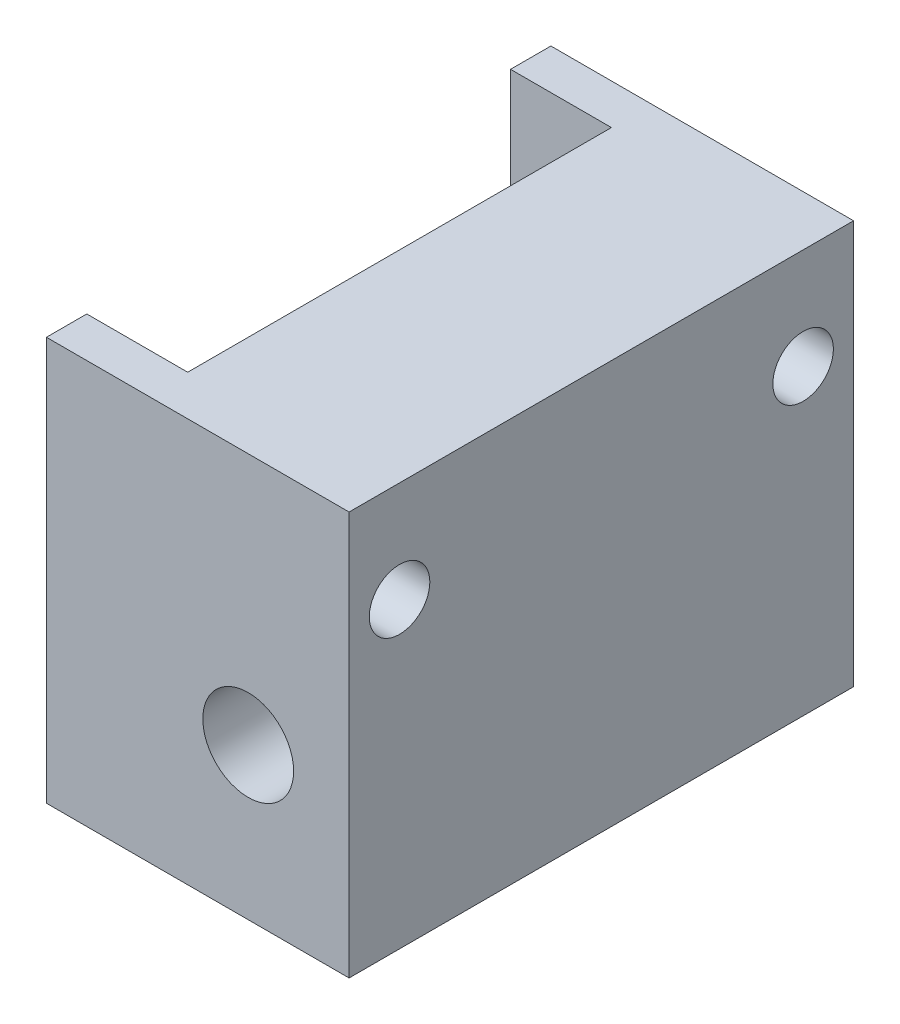
ISO-10303-21;
HEADER;
FILE_DESCRIPTION(('STEP AP214'),'2;1');
FILE_NAME('part.step','',(''),(''),'','','');
FILE_SCHEMA(('AUTOMOTIVE_DESIGN { 1 0 10303 214 1 1 1 1 }'));
ENDSEC;
DATA;
#1=APPLICATION_CONTEXT('core data for automotive mechanical design processes');
#2=APPLICATION_PROTOCOL_DEFINITION('international standard','automotive_design',2000,#1);
#3=PRODUCT_CONTEXT('',#1,'mechanical');
#4=PRODUCT('Part','Part','',(#3));
#5=PRODUCT_RELATED_PRODUCT_CATEGORY('part','',(#4));
#6=PRODUCT_DEFINITION_FORMATION('','',#4);
#7=PRODUCT_DEFINITION_CONTEXT('part definition',#1,'design');
#8=PRODUCT_DEFINITION('design','',#6,#7);
#9=PRODUCT_DEFINITION_SHAPE('','',#8);
#10=(LENGTH_UNIT() NAMED_UNIT(*) SI_UNIT(.MILLI.,.METRE.));
#11=(NAMED_UNIT(*) PLANE_ANGLE_UNIT() SI_UNIT($,.RADIAN.));
#12=(NAMED_UNIT(*) SI_UNIT($,.STERADIAN.) SOLID_ANGLE_UNIT());
#13=UNCERTAINTY_MEASURE_WITH_UNIT(LENGTH_MEASURE(1.E-05),#10,'distance_accuracy_value','');
#14=(GEOMETRIC_REPRESENTATION_CONTEXT(3) GLOBAL_UNCERTAINTY_ASSIGNED_CONTEXT((#13)) GLOBAL_UNIT_ASSIGNED_CONTEXT((#10,
#11,#12)) REPRESENTATION_CONTEXT('',''));
#15=CARTESIAN_POINT('',(0.,0.,0.));
#16=DIRECTION('',(0.,0.,1.));
#17=DIRECTION('',(1.,0.,0.));
#18=AXIS2_PLACEMENT_3D('',#15,#16,#17);
#19=CARTESIAN_POINT('',(-13.8064516129032,40.,-10.2096774193548));
#20=DIRECTION('',(1.,0.,0.));
#21=DIRECTION('',(0.,0.,-1.));
#22=AXIS2_PLACEMENT_3D('',#19,#20,#21);
#23=PLANE('',#22);
#24=DIRECTION('',(0.,-1.,0.));
#25=VECTOR('',#24,1.);
#26=CARTESIAN_POINT('',(-13.8064516129032,0.,35.7903225806452));
#27=LINE('',#26,#25);
#28=CARTESIAN_POINT('',(-13.8064516129032,40.,35.7903225806452));
#29=VERTEX_POINT('',#28);
#30=CARTESIAN_POINT('',(-13.8064516129032,32.8284271247462,35.7903225806452));
#31=VERTEX_POINT('',#30);
#32=EDGE_CURVE('E49',#29,#31,#27,.T.);
#33=ORIENTED_EDGE('',*,*,#32,.F.);
#34=DIRECTION('',(0.,0.,1.));
#35=VECTOR('',#34,1.);
#36=CARTESIAN_POINT('',(-13.8064516129032,40.,-10.2096774193548));
#37=LINE('',#36,#35);
#38=CARTESIAN_POINT('',(-13.8064516129032,40.,-6.20967741935483));
#39=VERTEX_POINT('',#38);
#40=EDGE_CURVE('E133',#39,#29,#37,.T.);
#41=ORIENTED_EDGE('',*,*,#40,.F.);
#42=DIRECTION('',(0.,1.,0.));
#43=VECTOR('',#42,1.);
#44=CARTESIAN_POINT('',(-13.8064516129032,0.,-6.20967741935483));
#45=LINE('',#44,#43);
#46=CARTESIAN_POINT('',(-13.8064516129032,32.8284271247462,-6.20967741935483));
#47=VERTEX_POINT('',#46);
#48=EDGE_CURVE('E11',#47,#39,#45,.T.);
#49=ORIENTED_EDGE('',*,*,#48,.F.);
#50=CARTESIAN_POINT('',(-13.8064516129032,30.,-5.20967741935483));
#51=DIRECTION('',(1.,0.,0.));
#52=DIRECTION('',(0.,0.,-1.));
#53=AXIS2_PLACEMENT_3D('',#50,#51,#52);
#54=CIRCLE('',#53,3.);
#55=CARTESIAN_POINT('',(-13.8064516129032,27.1715728752538,-6.20967741935483));
#56=VERTEX_POINT('',#55);
#57=EDGE_CURVE('E176',#47,#56,#54,.T.);
#58=ORIENTED_EDGE('',*,*,#57,.T.);
#59=CARTESIAN_POINT('',(-13.8064516129032,0.,-6.20967741935483));
#60=VERTEX_POINT('',#59);
#61=EDGE_CURVE('E137',#60,#56,#45,.T.);
#62=ORIENTED_EDGE('',*,*,#61,.F.);
#63=DIRECTION('',(0.,0.,1.));
#64=VECTOR('',#63,1.);
#65=CARTESIAN_POINT('',(-13.8064516129032,0.,-10.2096774193548));
#66=LINE('',#65,#64);
#67=CARTESIAN_POINT('',(-13.8064516129032,0.,35.7903225806452));
#68=VERTEX_POINT('',#67);
#69=EDGE_CURVE('E56',#60,#68,#66,.T.);
#70=ORIENTED_EDGE('',*,*,#69,.T.);
#71=CARTESIAN_POINT('',(-13.8064516129032,27.1715728752538,35.7903225806452));
#72=VERTEX_POINT('',#71);
#73=EDGE_CURVE('E236',#72,#68,#27,.T.);
#74=ORIENTED_EDGE('',*,*,#73,.F.);
#75=CARTESIAN_POINT('',(-13.8064516129032,30.,34.7903225806452));
#76=DIRECTION('',(1.,0.,0.));
#77=DIRECTION('',(0.,0.,-1.));
#78=AXIS2_PLACEMENT_3D('',#75,#76,#77);
#79=CIRCLE('',#78,3.);
#80=EDGE_CURVE('E186',#72,#31,#79,.T.);
#81=ORIENTED_EDGE('',*,*,#80,.T.);
#82=EDGE_LOOP('',(#33,#41,#49,#58,#62,#70,#74,#81));
#83=FACE_BOUND('',#82,.T.);
#84=ADVANCED_FACE('F33',(#83),#23,.F.);
#85=CARTESIAN_POINT('',(-13.8064516129032,40.,39.7903225806452));
#86=DIRECTION('',(0.,0.,-1.));
#87=DIRECTION('',(-1.,0.,0.));
#88=AXIS2_PLACEMENT_3D('',#85,#86,#87);
#89=PLANE('',#88);
#90=CARTESIAN_POINT('',(-3.80645161290322,15.,39.7903225806452));
#91=DIRECTION('',(0.,0.,1.));
#92=DIRECTION('',(1.,0.,0.));
#93=AXIS2_PLACEMENT_3D('',#90,#91,#92);
#94=CIRCLE('',#93,4.5);
#95=CARTESIAN_POINT('',(0.693548387096778,15.,39.7903225806452));
#96=VERTEX_POINT('',#95);
#97=EDGE_CURVE('E190',#96,#96,#94,.T.);
#98=ORIENTED_EDGE('',*,*,#97,.F.);
#99=EDGE_LOOP('',(#98));
#100=FACE_BOUND('',#99,.T.);
#101=DIRECTION('',(1.,0.,0.));
#102=VECTOR('',#101,1.);
#103=CARTESIAN_POINT('',(-13.8064516129032,0.,39.7903225806452));
#104=LINE('',#103,#102);
#105=CARTESIAN_POINT('',(-23.8064516129032,0.,39.7903225806452));
#106=VERTEX_POINT('',#105);
#107=CARTESIAN_POINT('',(6.19354838709678,0.,39.7903225806452));
#108=VERTEX_POINT('',#107);
#109=EDGE_CURVE('E202',#106,#108,#104,.T.);
#110=ORIENTED_EDGE('',*,*,#109,.T.);
#111=DIRECTION('',(0.,-1.,0.));
#112=VECTOR('',#111,1.);
#113=CARTESIAN_POINT('',(6.19354838709678,40.,39.7903225806452));
#114=LINE('',#113,#112);
#115=CARTESIAN_POINT('',(6.19354838709678,40.,39.7903225806452));
#116=VERTEX_POINT('',#115);
#117=EDGE_CURVE('E41',#116,#108,#114,.T.);
#118=ORIENTED_EDGE('',*,*,#117,.F.);
#119=DIRECTION('',(1.,0.,0.));
#120=VECTOR('',#119,1.);
#121=CARTESIAN_POINT('',(-13.8064516129032,40.,39.7903225806452));
#122=LINE('',#121,#120);
#123=CARTESIAN_POINT('',(-23.8064516129032,40.,39.7903225806452));
#124=VERTEX_POINT('',#123);
#125=EDGE_CURVE('E196',#124,#116,#122,.T.);
#126=ORIENTED_EDGE('',*,*,#125,.F.);
#127=DIRECTION('',(0.,1.,0.));
#128=VECTOR('',#127,1.);
#129=CARTESIAN_POINT('',(-23.8064516129032,40.,39.7903225806452));
#130=LINE('',#129,#128);
#131=EDGE_CURVE('E128',#106,#124,#130,.T.);
#132=ORIENTED_EDGE('',*,*,#131,.F.);
#133=EDGE_LOOP('',(#110,#118,#126,#132));
#134=FACE_BOUND('',#133,.T.);
#135=ADVANCED_FACE('F257',(#100,#134),#89,.F.);
#136=CARTESIAN_POINT('',(6.19354838709677,40.,-10.2096774193548));
#137=DIRECTION('',(-1.,0.,0.));
#138=DIRECTION('',(0.,0.,1.));
#139=AXIS2_PLACEMENT_3D('',#136,#137,#138);
#140=PLANE('',#139);
#141=CARTESIAN_POINT('',(6.19354838709677,30.,-5.20967741935483));
#142=DIRECTION('',(1.,0.,0.));
#143=DIRECTION('',(0.,0.,-1.));
#144=AXIS2_PLACEMENT_3D('',#141,#142,#143);
#145=CIRCLE('',#144,3.);
#146=CARTESIAN_POINT('',(6.19354838709677,30.,-8.20967741935483));
#147=VERTEX_POINT('',#146);
#148=EDGE_CURVE('E155',#147,#147,#145,.T.);
#149=ORIENTED_EDGE('',*,*,#148,.F.);
#150=EDGE_LOOP('',(#149));
#151=FACE_BOUND('',#150,.T.);
#152=CARTESIAN_POINT('',(6.19354838709678,30.,34.7903225806452));
#153=DIRECTION('',(1.,0.,0.));
#154=DIRECTION('',(0.,0.,-1.));
#155=AXIS2_PLACEMENT_3D('',#152,#153,#154);
#156=CIRCLE('',#155,3.);
#157=CARTESIAN_POINT('',(6.19354838709678,30.,31.7903225806452));
#158=VERTEX_POINT('',#157);
#159=EDGE_CURVE('E180',#158,#158,#156,.T.);
#160=ORIENTED_EDGE('',*,*,#159,.F.);
#161=EDGE_LOOP('',(#160));
#162=FACE_BOUND('',#161,.T.);
#163=DIRECTION('',(0.,0.,-1.));
#164=VECTOR('',#163,1.);
#165=CARTESIAN_POINT('',(6.19354838709677,0.,-10.2096774193548));
#166=LINE('',#165,#164);
#167=CARTESIAN_POINT('',(6.19354838709677,0.,-10.2096774193548));
#168=VERTEX_POINT('',#167);
#169=EDGE_CURVE('E209',#108,#168,#166,.T.);
#170=ORIENTED_EDGE('',*,*,#169,.T.);
#171=DIRECTION('',(0.,-1.,0.));
#172=VECTOR('',#171,1.);
#173=CARTESIAN_POINT('',(6.19354838709677,40.,-10.2096774193548));
#174=LINE('',#173,#172);
#175=CARTESIAN_POINT('',(6.19354838709677,40.,-10.2096774193548));
#176=VERTEX_POINT('',#175);
#177=EDGE_CURVE('E212',#176,#168,#174,.T.);
#178=ORIENTED_EDGE('',*,*,#177,.F.);
#179=DIRECTION('',(0.,0.,-1.));
#180=VECTOR('',#179,1.);
#181=CARTESIAN_POINT('',(6.19354838709677,40.,-10.2096774193548));
#182=LINE('',#181,#180);
#183=EDGE_CURVE('E221',#116,#176,#182,.T.);
#184=ORIENTED_EDGE('',*,*,#183,.F.);
#185=ORIENTED_EDGE('',*,*,#117,.T.);
#186=EDGE_LOOP('',(#170,#178,#184,#185));
#187=FACE_BOUND('',#186,.T.);
#188=ADVANCED_FACE('F219',(#151,#162,#187),#140,.F.);
#189=CARTESIAN_POINT('',(-13.8064516129032,40.,-10.2096774193548));
#190=DIRECTION('',(0.,0.,1.));
#191=DIRECTION('',(1.,0.,0.));
#192=AXIS2_PLACEMENT_3D('',#189,#190,#191);
#193=PLANE('',#192);
#194=CARTESIAN_POINT('',(-3.80645161290322,15.,-10.2096774193548));
#195=DIRECTION('',(0.,0.,1.));
#196=DIRECTION('',(1.,0.,0.));
#197=AXIS2_PLACEMENT_3D('',#194,#195,#196);
#198=CIRCLE('',#197,4.5);
#199=CARTESIAN_POINT('',(0.693548387096778,15.,-10.2096774193548));
#200=VERTEX_POINT('',#199);
#201=EDGE_CURVE('E193',#200,#200,#198,.T.);
#202=ORIENTED_EDGE('',*,*,#201,.T.);
#203=EDGE_LOOP('',(#202));
#204=FACE_BOUND('',#203,.T.);
#205=DIRECTION('',(-1.,0.,0.));
#206=VECTOR('',#205,1.);
#207=CARTESIAN_POINT('',(-13.8064516129032,0.,-10.2096774193548));
#208=LINE('',#207,#206);
#209=CARTESIAN_POINT('',(-23.8064516129032,0.,-10.2096774193548));
#210=VERTEX_POINT('',#209);
#211=EDGE_CURVE('E199',#168,#210,#208,.T.);
#212=ORIENTED_EDGE('',*,*,#211,.T.);
#213=DIRECTION('',(0.,-1.,0.));
#214=VECTOR('',#213,1.);
#215=CARTESIAN_POINT('',(-23.8064516129032,40.,-10.2096774193548));
#216=LINE('',#215,#214);
#217=CARTESIAN_POINT('',(-23.8064516129032,40.,-10.2096774193548));
#218=VERTEX_POINT('',#217);
#219=EDGE_CURVE('E150',#218,#210,#216,.T.);
#220=ORIENTED_EDGE('',*,*,#219,.F.);
#221=DIRECTION('',(-1.,0.,0.));
#222=VECTOR('',#221,1.);
#223=CARTESIAN_POINT('',(-13.8064516129032,40.,-10.2096774193548));
#224=LINE('',#223,#222);
#225=EDGE_CURVE('E207',#176,#218,#224,.T.);
#226=ORIENTED_EDGE('',*,*,#225,.F.);
#227=ORIENTED_EDGE('',*,*,#177,.T.);
#228=EDGE_LOOP('',(#212,#220,#226,#227));
#229=FACE_BOUND('',#228,.T.);
#230=ADVANCED_FACE('F229',(#204,#229),#193,.F.);
#231=CARTESIAN_POINT('',(0.,40.,0.));
#232=DIRECTION('',(0.,1.,0.));
#233=DIRECTION('',(0.,0.,1.));
#234=AXIS2_PLACEMENT_3D('',#231,#232,#233);
#235=PLANE('',#234);
#236=ORIENTED_EDGE('',*,*,#225,.T.);
#237=DIRECTION('',(0.,0.,-1.));
#238=VECTOR('',#237,1.);
#239=CARTESIAN_POINT('',(-23.8064516129032,40.,-6.20967741935483));
#240=LINE('',#239,#238);
#241=CARTESIAN_POINT('',(-23.8064516129032,40.,-6.20967741935483));
#242=VERTEX_POINT('',#241);
#243=EDGE_CURVE('E147',#242,#218,#240,.T.);
#244=ORIENTED_EDGE('',*,*,#243,.F.);
#245=DIRECTION('',(1.,0.,0.));
#246=VECTOR('',#245,1.);
#247=CARTESIAN_POINT('',(-23.8064516129032,40.,-6.20967741935483));
#248=LINE('',#247,#246);
#249=EDGE_CURVE('E152',#242,#39,#248,.T.);
#250=ORIENTED_EDGE('',*,*,#249,.T.);
#251=ORIENTED_EDGE('',*,*,#40,.T.);
#252=DIRECTION('',(1.,0.,0.));
#253=VECTOR('',#252,1.);
#254=CARTESIAN_POINT('',(-23.8064516129032,40.,35.7903225806452));
#255=LINE('',#254,#253);
#256=CARTESIAN_POINT('',(-23.8064516129032,40.,35.7903225806452));
#257=VERTEX_POINT('',#256);
#258=EDGE_CURVE('E115',#257,#29,#255,.T.);
#259=ORIENTED_EDGE('',*,*,#258,.F.);
#260=DIRECTION('',(0.,0.,-1.));
#261=VECTOR('',#260,1.);
#262=CARTESIAN_POINT('',(-23.8064516129032,40.,35.7903225806452));
#263=LINE('',#262,#261);
#264=EDGE_CURVE('E122',#124,#257,#263,.T.);
#265=ORIENTED_EDGE('',*,*,#264,.F.);
#266=ORIENTED_EDGE('',*,*,#125,.T.);
#267=ORIENTED_EDGE('',*,*,#183,.T.);
#268=EDGE_LOOP('',(#236,#244,#250,#251,#259,#265,#266,#267));
#269=FACE_BOUND('',#268,.T.);
#270=ADVANCED_FACE('F131',(#269),#235,.T.);
#271=CARTESIAN_POINT('',(0.,0.,0.));
#272=DIRECTION('',(0.,1.,0.));
#273=DIRECTION('',(0.,0.,1.));
#274=AXIS2_PLACEMENT_3D('',#271,#272,#273);
#275=PLANE('',#274);
#276=ORIENTED_EDGE('',*,*,#69,.F.);
#277=DIRECTION('',(1.,0.,0.));
#278=VECTOR('',#277,1.);
#279=CARTESIAN_POINT('',(-23.8064516129032,0.,-6.20967741935483));
#280=LINE('',#279,#278);
#281=CARTESIAN_POINT('',(-23.8064516129032,0.,-6.20967741935483));
#282=VERTEX_POINT('',#281);
#283=EDGE_CURVE('E164',#282,#60,#280,.T.);
#284=ORIENTED_EDGE('',*,*,#283,.F.);
#285=DIRECTION('',(0.,0.,1.));
#286=VECTOR('',#285,1.);
#287=CARTESIAN_POINT('',(-23.8064516129032,0.,-10.2096774193548));
#288=LINE('',#287,#286);
#289=EDGE_CURVE('E142',#210,#282,#288,.T.);
#290=ORIENTED_EDGE('',*,*,#289,.F.);
#291=ORIENTED_EDGE('',*,*,#211,.F.);
#292=ORIENTED_EDGE('',*,*,#169,.F.);
#293=ORIENTED_EDGE('',*,*,#109,.F.);
#294=DIRECTION('',(0.,0.,1.));
#295=VECTOR('',#294,1.);
#296=CARTESIAN_POINT('',(-23.8064516129032,0.,39.7903225806452));
#297=LINE('',#296,#295);
#298=CARTESIAN_POINT('',(-23.8064516129032,0.,35.7903225806452));
#299=VERTEX_POINT('',#298);
#300=EDGE_CURVE('E121',#299,#106,#297,.T.);
#301=ORIENTED_EDGE('',*,*,#300,.F.);
#302=DIRECTION('',(1.,0.,0.));
#303=VECTOR('',#302,1.);
#304=CARTESIAN_POINT('',(-23.8064516129032,0.,35.7903225806452));
#305=LINE('',#304,#303);
#306=EDGE_CURVE('E117',#299,#68,#305,.T.);
#307=ORIENTED_EDGE('',*,*,#306,.T.);
#308=EDGE_LOOP('',(#276,#284,#290,#291,#292,#293,#301,#307));
#309=FACE_BOUND('',#308,.T.);
#310=ADVANCED_FACE('F225',(#309),#275,.F.);
#311=CARTESIAN_POINT('',(-3.80645161290322,15.,-20.2096774193548));
#312=DIRECTION('',(0.,0.,1.));
#313=DIRECTION('',(1.,0.,0.));
#314=AXIS2_PLACEMENT_3D('',#311,#312,#313);
#315=CYLINDRICAL_SURFACE('',#314,4.5);
#316=ORIENTED_EDGE('',*,*,#97,.T.);
#317=EDGE_LOOP('',(#316));
#318=FACE_BOUND('',#317,.T.);
#319=ORIENTED_EDGE('',*,*,#201,.F.);
#320=EDGE_LOOP('',(#319));
#321=FACE_BOUND('',#320,.T.);
#322=ADVANCED_FACE('F245',(#318,#321),#315,.F.);
#323=CARTESIAN_POINT('',(-53.8064516129032,30.,34.7903225806452));
#324=DIRECTION('',(1.,0.,0.));
#325=DIRECTION('',(0.,0.,-1.));
#326=AXIS2_PLACEMENT_3D('',#323,#324,#325);
#327=CYLINDRICAL_SURFACE('',#326,3.);
#328=ORIENTED_EDGE('',*,*,#159,.T.);
#329=EDGE_LOOP('',(#328));
#330=FACE_BOUND('',#329,.T.);
#331=EDGE_CURVE('E187',#31,#72,#79,.T.);
#332=ORIENTED_EDGE('',*,*,#331,.F.);
#333=ORIENTED_EDGE('',*,*,#80,.F.);
#334=EDGE_LOOP('',(#332,#333));
#335=FACE_BOUND('',#334,.T.);
#336=ADVANCED_FACE('F243',(#330,#335),#327,.F.);
#337=CARTESIAN_POINT('',(-53.8064516129032,30.,-5.20967741935483));
#338=DIRECTION('',(1.,0.,0.));
#339=DIRECTION('',(0.,0.,-1.));
#340=AXIS2_PLACEMENT_3D('',#337,#338,#339);
#341=CYLINDRICAL_SURFACE('',#340,3.);
#342=ORIENTED_EDGE('',*,*,#148,.T.);
#343=EDGE_LOOP('',(#342));
#344=FACE_BOUND('',#343,.T.);
#345=ORIENTED_EDGE('',*,*,#57,.F.);
#346=EDGE_CURVE('E169',#56,#47,#54,.T.);
#347=ORIENTED_EDGE('',*,*,#346,.F.);
#348=EDGE_LOOP('',(#345,#347));
#349=FACE_BOUND('',#348,.T.);
#350=ADVANCED_FACE('F179',(#344,#349),#341,.F.);
#351=CARTESIAN_POINT('',(-13.8064516129032,0.,0.));
#352=DIRECTION('',(-1.,0.,0.));
#353=DIRECTION('',(0.,0.,1.));
#354=AXIS2_PLACEMENT_3D('',#351,#352,#353);
#355=PLANE('',#354);
#356=EDGE_CURVE('E134',#56,#47,#45,.T.);
#357=ORIENTED_EDGE('',*,*,#356,.F.);
#358=ORIENTED_EDGE('',*,*,#346,.T.);
#359=EDGE_LOOP('',(#357,#358));
#360=FACE_BOUND('',#359,.T.);
#361=ADVANCED_FACE('F182',(#360),#355,.F.);
#362=CARTESIAN_POINT('',(-23.8064516129032,0.,-6.20967741935483));
#363=DIRECTION('',(0.,0.,-1.));
#364=DIRECTION('',(-1.,0.,0.));
#365=AXIS2_PLACEMENT_3D('',#362,#363,#364);
#366=PLANE('',#365);
#367=ORIENTED_EDGE('',*,*,#61,.T.);
#368=ORIENTED_EDGE('',*,*,#356,.T.);
#369=ORIENTED_EDGE('',*,*,#48,.T.);
#370=ORIENTED_EDGE('',*,*,#249,.F.);
#371=DIRECTION('',(0.,1.,0.));
#372=VECTOR('',#371,1.);
#373=CARTESIAN_POINT('',(-23.8064516129032,0.,-6.20967741935483));
#374=LINE('',#373,#372);
#375=EDGE_CURVE('E145',#282,#242,#374,.T.);
#376=ORIENTED_EDGE('',*,*,#375,.F.);
#377=ORIENTED_EDGE('',*,*,#283,.T.);
#378=EDGE_LOOP('',(#367,#368,#369,#370,#376,#377));
#379=FACE_BOUND('',#378,.T.);
#380=ADVANCED_FACE('F172',(#379),#366,.F.);
#381=CARTESIAN_POINT('',(-23.8064516129032,0.,0.));
#382=DIRECTION('',(-1.,0.,0.));
#383=DIRECTION('',(0.,0.,1.));
#384=AXIS2_PLACEMENT_3D('',#381,#382,#383);
#385=PLANE('',#384);
#386=ORIENTED_EDGE('',*,*,#289,.T.);
#387=ORIENTED_EDGE('',*,*,#375,.T.);
#388=ORIENTED_EDGE('',*,*,#243,.T.);
#389=ORIENTED_EDGE('',*,*,#219,.T.);
#390=EDGE_LOOP('',(#386,#387,#388,#389));
#391=FACE_BOUND('',#390,.T.);
#392=ADVANCED_FACE('F232',(#391),#385,.T.);
#393=CARTESIAN_POINT('',(-13.8064516129032,0.,0.));
#394=DIRECTION('',(1.,0.,0.));
#395=DIRECTION('',(0.,0.,-1.));
#396=AXIS2_PLACEMENT_3D('',#393,#394,#395);
#397=PLANE('',#396);
#398=ORIENTED_EDGE('',*,*,#331,.T.);
#399=EDGE_CURVE('E235',#31,#72,#27,.T.);
#400=ORIENTED_EDGE('',*,*,#399,.F.);
#401=EDGE_LOOP('',(#398,#400));
#402=FACE_BOUND('',#401,.T.);
#403=ADVANCED_FACE('F241',(#402),#397,.T.);
#404=CARTESIAN_POINT('',(-23.8064516129032,0.,35.7903225806452));
#405=DIRECTION('',(0.,0.,1.));
#406=DIRECTION('',(1.,0.,0.));
#407=AXIS2_PLACEMENT_3D('',#404,#405,#406);
#408=PLANE('',#407);
#409=ORIENTED_EDGE('',*,*,#32,.T.);
#410=ORIENTED_EDGE('',*,*,#399,.T.);
#411=ORIENTED_EDGE('',*,*,#73,.T.);
#412=ORIENTED_EDGE('',*,*,#306,.F.);
#413=DIRECTION('',(0.,-1.,0.));
#414=VECTOR('',#413,1.);
#415=CARTESIAN_POINT('',(-23.8064516129032,0.,35.7903225806452));
#416=LINE('',#415,#414);
#417=EDGE_CURVE('E111',#257,#299,#416,.T.);
#418=ORIENTED_EDGE('',*,*,#417,.F.);
#419=ORIENTED_EDGE('',*,*,#258,.T.);
#420=EDGE_LOOP('',(#409,#410,#411,#412,#418,#419));
#421=FACE_BOUND('',#420,.T.);
#422=ADVANCED_FACE('F113',(#421),#408,.F.);
#423=CARTESIAN_POINT('',(-23.8064516129032,0.,0.));
#424=DIRECTION('',(1.,0.,0.));
#425=DIRECTION('',(0.,0.,-1.));
#426=AXIS2_PLACEMENT_3D('',#423,#424,#425);
#427=PLANE('',#426);
#428=ORIENTED_EDGE('',*,*,#264,.T.);
#429=ORIENTED_EDGE('',*,*,#417,.T.);
#430=ORIENTED_EDGE('',*,*,#300,.T.);
#431=ORIENTED_EDGE('',*,*,#131,.T.);
#432=EDGE_LOOP('',(#428,#429,#430,#431));
#433=FACE_BOUND('',#432,.T.);
#434=ADVANCED_FACE('F126',(#433),#427,.F.);
#435=CLOSED_SHELL('',(#84,#135,#188,#230,#270,#310,#322,#336,#350,#361,#380,#392,#403,#422,#434));
#436=MANIFOLD_SOLID_BREP('B2',#435);
#437=ADVANCED_BREP_SHAPE_REPRESENTATION('',(#18,#436),#14);
#438=SHAPE_DEFINITION_REPRESENTATION(#9,#437);
ENDSEC;
END-ISO-10303-21;
